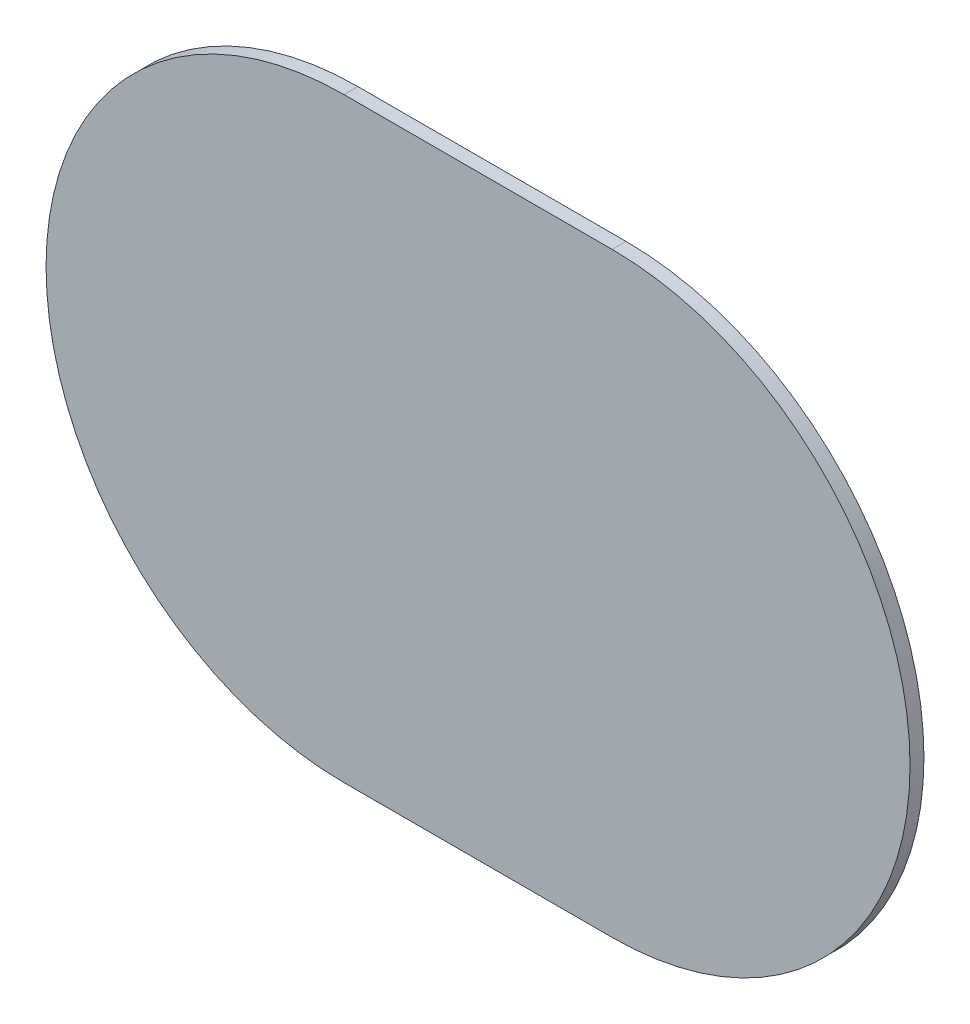
ISO-10303-21;
HEADER;
FILE_DESCRIPTION(('STEP AP214'),'2;1');
FILE_NAME('part.step','',(''),(''),'','','');
FILE_SCHEMA(('AUTOMOTIVE_DESIGN { 1 0 10303 214 1 1 1 1 }'));
ENDSEC;
DATA;
#1=APPLICATION_CONTEXT('core data for automotive mechanical design processes');
#2=APPLICATION_PROTOCOL_DEFINITION('international standard','automotive_design',2000,#1);
#3=PRODUCT_CONTEXT('',#1,'mechanical');
#4=PRODUCT('Part','Part','',(#3));
#5=PRODUCT_RELATED_PRODUCT_CATEGORY('part','',(#4));
#6=PRODUCT_DEFINITION_FORMATION('','',#4);
#7=PRODUCT_DEFINITION_CONTEXT('part definition',#1,'design');
#8=PRODUCT_DEFINITION('design','',#6,#7);
#9=PRODUCT_DEFINITION_SHAPE('','',#8);
#10=(LENGTH_UNIT() NAMED_UNIT(*) SI_UNIT(.MILLI.,.METRE.));
#11=(NAMED_UNIT(*) PLANE_ANGLE_UNIT() SI_UNIT($,.RADIAN.));
#12=(NAMED_UNIT(*) SI_UNIT($,.STERADIAN.) SOLID_ANGLE_UNIT());
#13=UNCERTAINTY_MEASURE_WITH_UNIT(LENGTH_MEASURE(1.E-05),#10,'distance_accuracy_value','');
#14=(GEOMETRIC_REPRESENTATION_CONTEXT(3) GLOBAL_UNCERTAINTY_ASSIGNED_CONTEXT((#13)) GLOBAL_UNIT_ASSIGNED_CONTEXT((#10,
#11,#12)) REPRESENTATION_CONTEXT('',''));
#15=CARTESIAN_POINT('',(0.,0.,0.));
#16=DIRECTION('',(0.,0.,1.));
#17=DIRECTION('',(1.,0.,0.));
#18=AXIS2_PLACEMENT_3D('',#15,#16,#17);
#19=CARTESIAN_POINT('',(-31.925,9.5,1.635));
#20=DIRECTION('',(0.,0.,1.));
#21=DIRECTION('',(1.,0.,0.));
#22=AXIS2_PLACEMENT_3D('',#19,#20,#21);
#23=PLANE('',#22);
#24=DIRECTION('',(1.,0.,0.));
#25=VECTOR('',#24,1.);
#26=CARTESIAN_POINT('',(-31.925,9.5,1.635));
#27=LINE('',#26,#25);
#28=CARTESIAN_POINT('',(-31.925,9.5,1.635));
#29=VERTEX_POINT('',#28);
#30=CARTESIAN_POINT('',(-31.25,9.5,1.635));
#31=VERTEX_POINT('',#30);
#32=EDGE_CURVE('E66',#29,#31,#27,.T.);
#33=ORIENTED_EDGE('',*,*,#32,.T.);
#34=CARTESIAN_POINT('',(-31.25,10.25,1.635));
#35=DIRECTION('',(0.,0.,1.));
#36=DIRECTION('',(0.,-1.,0.));
#37=AXIS2_PLACEMENT_3D('',#34,#35,#36);
#38=CIRCLE('',#37,0.75);
#39=CARTESIAN_POINT('',(-31.25,11.,1.635));
#40=VERTEX_POINT('',#39);
#41=EDGE_CURVE('E97',#31,#40,#38,.T.);
#42=ORIENTED_EDGE('',*,*,#41,.T.);
#43=DIRECTION('',(-1.,0.,0.));
#44=VECTOR('',#43,1.);
#45=CARTESIAN_POINT('',(-31.25,11.,1.635));
#46=LINE('',#45,#44);
#47=CARTESIAN_POINT('',(-31.925,11.,1.635));
#48=VERTEX_POINT('',#47);
#49=EDGE_CURVE('E68',#40,#48,#46,.T.);
#50=ORIENTED_EDGE('',*,*,#49,.T.);
#51=CARTESIAN_POINT('',(-31.925,10.25,1.635));
#52=DIRECTION('',(0.,0.,1.));
#53=DIRECTION('',(0.,1.,0.));
#54=AXIS2_PLACEMENT_3D('',#51,#52,#53);
#55=CIRCLE('',#54,0.75);
#56=EDGE_CURVE('E11',#48,#29,#55,.T.);
#57=ORIENTED_EDGE('',*,*,#56,.T.);
#58=EDGE_LOOP('',(#33,#42,#50,#57));
#59=FACE_BOUND('',#58,.T.);
#60=ADVANCED_FACE('F16',(#59),#23,.T.);
#61=CARTESIAN_POINT('',(-31.925,9.5,1.6));
#62=DIRECTION('',(0.,0.,1.));
#63=DIRECTION('',(1.,0.,0.));
#64=AXIS2_PLACEMENT_3D('',#61,#62,#63);
#65=PLANE('',#64);
#66=CARTESIAN_POINT('',(-31.925,10.25,1.6));
#67=DIRECTION('',(0.,0.,1.));
#68=DIRECTION('',(0.,1.,0.));
#69=AXIS2_PLACEMENT_3D('',#66,#67,#68);
#70=CIRCLE('',#69,0.75);
#71=CARTESIAN_POINT('',(-31.925,11.,1.6));
#72=VERTEX_POINT('',#71);
#73=CARTESIAN_POINT('',(-31.925,9.5,1.6));
#74=VERTEX_POINT('',#73);
#75=EDGE_CURVE('E27',#72,#74,#70,.T.);
#76=ORIENTED_EDGE('',*,*,#75,.F.);
#77=DIRECTION('',(-1.,0.,0.));
#78=VECTOR('',#77,1.);
#79=CARTESIAN_POINT('',(-31.25,11.,1.6));
#80=LINE('',#79,#78);
#81=CARTESIAN_POINT('',(-31.25,11.,1.6));
#82=VERTEX_POINT('',#81);
#83=EDGE_CURVE('E20',#82,#72,#80,.T.);
#84=ORIENTED_EDGE('',*,*,#83,.F.);
#85=CARTESIAN_POINT('',(-31.25,10.25,1.6));
#86=DIRECTION('',(0.,0.,1.));
#87=DIRECTION('',(0.,-1.,0.));
#88=AXIS2_PLACEMENT_3D('',#85,#86,#87);
#89=CIRCLE('',#88,0.75);
#90=CARTESIAN_POINT('',(-31.25,9.5,1.6));
#91=VERTEX_POINT('',#90);
#92=EDGE_CURVE('E77',#91,#82,#89,.T.);
#93=ORIENTED_EDGE('',*,*,#92,.F.);
#94=DIRECTION('',(1.,0.,0.));
#95=VECTOR('',#94,1.);
#96=CARTESIAN_POINT('',(-31.925,9.5,1.6));
#97=LINE('',#96,#95);
#98=EDGE_CURVE('E87',#74,#91,#97,.T.);
#99=ORIENTED_EDGE('',*,*,#98,.F.);
#100=EDGE_LOOP('',(#76,#84,#93,#99));
#101=FACE_BOUND('',#100,.T.);
#102=ADVANCED_FACE('F180',(#101),#65,.F.);
#103=CARTESIAN_POINT('',(-31.925,10.25,1.6));
#104=DIRECTION('',(0.,0.,-1.));
#105=DIRECTION('',(0.,1.,0.));
#106=AXIS2_PLACEMENT_3D('',#103,#104,#105);
#107=CYLINDRICAL_SURFACE('',#106,0.75);
#108=ORIENTED_EDGE('',*,*,#75,.T.);
#109=DIRECTION('',(0.,0.,1.));
#110=VECTOR('',#109,1.);
#111=CARTESIAN_POINT('',(-31.925,9.5,1.6));
#112=LINE('',#111,#110);
#113=EDGE_CURVE('E72',#74,#29,#112,.T.);
#114=ORIENTED_EDGE('',*,*,#113,.T.);
#115=ORIENTED_EDGE('',*,*,#56,.F.);
#116=DIRECTION('',(0.,0.,1.));
#117=VECTOR('',#116,1.);
#118=CARTESIAN_POINT('',(-31.925,11.,1.6));
#119=LINE('',#118,#117);
#120=EDGE_CURVE('E94',#72,#48,#119,.T.);
#121=ORIENTED_EDGE('',*,*,#120,.F.);
#122=EDGE_LOOP('',(#108,#114,#115,#121));
#123=FACE_BOUND('',#122,.T.);
#124=ADVANCED_FACE('F18',(#123),#107,.T.);
#125=CARTESIAN_POINT('',(-31.25,11.,1.6));
#126=DIRECTION('',(0.,-1.,0.));
#127=DIRECTION('',(0.,0.,-1.));
#128=AXIS2_PLACEMENT_3D('',#125,#126,#127);
#129=PLANE('',#128);
#130=ORIENTED_EDGE('',*,*,#83,.T.);
#131=ORIENTED_EDGE('',*,*,#120,.T.);
#132=ORIENTED_EDGE('',*,*,#49,.F.);
#133=DIRECTION('',(0.,0.,1.));
#134=VECTOR('',#133,1.);
#135=CARTESIAN_POINT('',(-31.25,11.,1.6));
#136=LINE('',#135,#134);
#137=EDGE_CURVE('E100',#82,#40,#136,.T.);
#138=ORIENTED_EDGE('',*,*,#137,.F.);
#139=EDGE_LOOP('',(#130,#131,#132,#138));
#140=FACE_BOUND('',#139,.T.);
#141=ADVANCED_FACE('F115',(#140),#129,.F.);
#142=CARTESIAN_POINT('',(-31.25,10.25,1.6));
#143=DIRECTION('',(0.,0.,-1.));
#144=DIRECTION('',(0.,-1.,0.));
#145=AXIS2_PLACEMENT_3D('',#142,#143,#144);
#146=CYLINDRICAL_SURFACE('',#145,0.75);
#147=ORIENTED_EDGE('',*,*,#92,.T.);
#148=ORIENTED_EDGE('',*,*,#137,.T.);
#149=ORIENTED_EDGE('',*,*,#41,.F.);
#150=DIRECTION('',(0.,0.,1.));
#151=VECTOR('',#150,1.);
#152=CARTESIAN_POINT('',(-31.25,9.5,1.6));
#153=LINE('',#152,#151);
#154=EDGE_CURVE('E81',#91,#31,#153,.T.);
#155=ORIENTED_EDGE('',*,*,#154,.F.);
#156=EDGE_LOOP('',(#147,#148,#149,#155));
#157=FACE_BOUND('',#156,.T.);
#158=ADVANCED_FACE('F112',(#157),#146,.T.);
#159=CARTESIAN_POINT('',(-31.925,9.5,1.6));
#160=DIRECTION('',(0.,1.,0.));
#161=DIRECTION('',(1.,0.,0.));
#162=AXIS2_PLACEMENT_3D('',#159,#160,#161);
#163=PLANE('',#162);
#164=ORIENTED_EDGE('',*,*,#98,.T.);
#165=ORIENTED_EDGE('',*,*,#154,.T.);
#166=ORIENTED_EDGE('',*,*,#32,.F.);
#167=ORIENTED_EDGE('',*,*,#113,.F.);
#168=EDGE_LOOP('',(#164,#165,#166,#167));
#169=FACE_BOUND('',#168,.T.);
#170=ADVANCED_FACE('F79',(#169),#163,.F.);
#171=CLOSED_SHELL('',(#60,#102,#124,#141,#158,#170));
#172=MANIFOLD_SOLID_BREP('B1',#171);
#173=ADVANCED_BREP_SHAPE_REPRESENTATION('',(#18,#172),#14);
#174=SHAPE_DEFINITION_REPRESENTATION(#9,#173);
ENDSEC;
END-ISO-10303-21;
